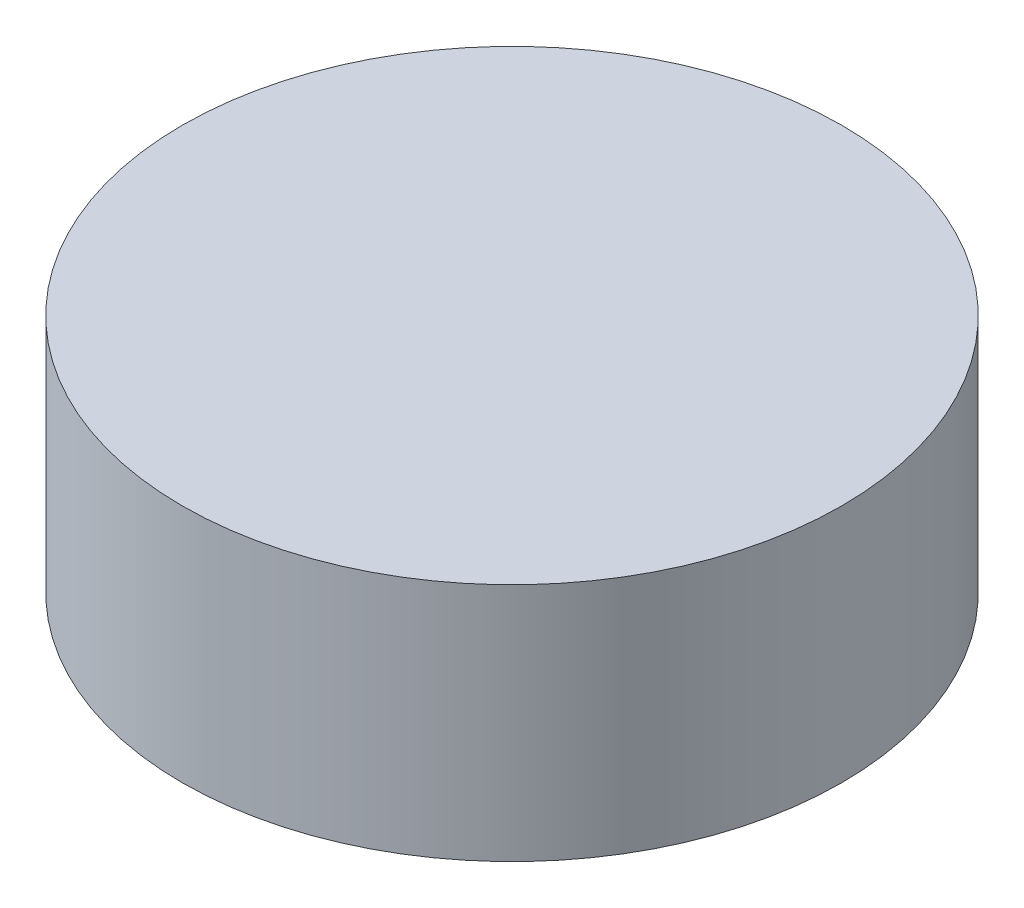
ISO-10303-21;
HEADER;
FILE_DESCRIPTION(('STEP AP214'),'2;1');
FILE_NAME('part.step','',(''),(''),'','','');
FILE_SCHEMA(('AUTOMOTIVE_DESIGN { 1 0 10303 214 1 1 1 1 }'));
ENDSEC;
DATA;
#1=APPLICATION_CONTEXT('core data for automotive mechanical design processes');
#2=APPLICATION_PROTOCOL_DEFINITION('international standard','automotive_design',2000,#1);
#3=PRODUCT_CONTEXT('',#1,'mechanical');
#4=PRODUCT('Part','Part','',(#3));
#5=PRODUCT_RELATED_PRODUCT_CATEGORY('part','',(#4));
#6=PRODUCT_DEFINITION_FORMATION('','',#4);
#7=PRODUCT_DEFINITION_CONTEXT('part definition',#1,'design');
#8=PRODUCT_DEFINITION('design','',#6,#7);
#9=PRODUCT_DEFINITION_SHAPE('','',#8);
#10=(LENGTH_UNIT() NAMED_UNIT(*) SI_UNIT(.MILLI.,.METRE.));
#11=(NAMED_UNIT(*) PLANE_ANGLE_UNIT() SI_UNIT($,.RADIAN.));
#12=(NAMED_UNIT(*) SI_UNIT($,.STERADIAN.) SOLID_ANGLE_UNIT());
#13=UNCERTAINTY_MEASURE_WITH_UNIT(LENGTH_MEASURE(1.E-05),#10,'distance_accuracy_value','');
#14=(GEOMETRIC_REPRESENTATION_CONTEXT(3) GLOBAL_UNCERTAINTY_ASSIGNED_CONTEXT((#13)) GLOBAL_UNIT_ASSIGNED_CONTEXT((#10,
#11,#12)) REPRESENTATION_CONTEXT('',''));
#15=CARTESIAN_POINT('',(0.,0.,0.));
#16=DIRECTION('',(0.,0.,1.));
#17=DIRECTION('',(1.,0.,0.));
#18=AXIS2_PLACEMENT_3D('',#15,#16,#17);
#19=CARTESIAN_POINT('',(0.,0.,0.));
#20=DIRECTION('',(0.,-1.,0.));
#21=DIRECTION('',(0.,0.,-1.));
#22=AXIS2_PLACEMENT_3D('',#19,#20,#21);
#23=CYLINDRICAL_SURFACE('',#22,25.4);
#24=CARTESIAN_POINT('',(0.,-17.78,0.));
#25=DIRECTION('',(0.,-1.,0.));
#26=DIRECTION('',(0.,0.,-1.));
#27=AXIS2_PLACEMENT_3D('',#24,#25,#26);
#28=CIRCLE('',#27,25.4);
#29=CARTESIAN_POINT('',(0.,-17.78,-25.4));
#30=VERTEX_POINT('',#29);
#31=EDGE_CURVE('E10',#30,#30,#28,.T.);
#32=ORIENTED_EDGE('',*,*,#31,.T.);
#33=EDGE_LOOP('',(#32));
#34=FACE_BOUND('',#33,.T.);
#35=CARTESIAN_POINT('',(0.,0.,0.));
#36=DIRECTION('',(0.,-1.,0.));
#37=DIRECTION('',(0.,0.,-1.));
#38=AXIS2_PLACEMENT_3D('',#35,#36,#37);
#39=CIRCLE('',#38,25.4);
#40=CARTESIAN_POINT('',(0.,0.,-25.4));
#41=VERTEX_POINT('',#40);
#42=EDGE_CURVE('E46',#41,#41,#39,.T.);
#43=ORIENTED_EDGE('',*,*,#42,.F.);
#44=EDGE_LOOP('',(#43));
#45=FACE_BOUND('',#44,.T.);
#46=ADVANCED_FACE('F32',(#34,#45),#23,.F.);
#47=CARTESIAN_POINT('',(0.,-17.78,0.));
#48=DIRECTION('',(0.,-1.,0.));
#49=DIRECTION('',(0.,0.,-1.));
#50=AXIS2_PLACEMENT_3D('',#47,#48,#49);
#51=PLANE('',#50);
#52=CARTESIAN_POINT('',(0.,-17.78,0.));
#53=DIRECTION('',(0.,-1.,0.));
#54=DIRECTION('',(0.,0.,-1.));
#55=AXIS2_PLACEMENT_3D('',#52,#53,#54);
#56=CIRCLE('',#55,27.94);
#57=CARTESIAN_POINT('',(0.,-17.78,-27.94));
#58=VERTEX_POINT('',#57);
#59=EDGE_CURVE('E38',#58,#58,#56,.T.);
#60=ORIENTED_EDGE('',*,*,#59,.T.);
#61=EDGE_LOOP('',(#60));
#62=FACE_BOUND('',#61,.T.);
#63=ORIENTED_EDGE('',*,*,#31,.F.);
#64=EDGE_LOOP('',(#63));
#65=FACE_BOUND('',#64,.T.);
#66=ADVANCED_FACE('F55',(#62,#65),#51,.T.);
#67=CARTESIAN_POINT('',(0.,0.,0.));
#68=DIRECTION('',(0.,-1.,0.));
#69=DIRECTION('',(0.,0.,-1.));
#70=AXIS2_PLACEMENT_3D('',#67,#68,#69);
#71=CYLINDRICAL_SURFACE('',#70,27.94);
#72=ORIENTED_EDGE('',*,*,#59,.F.);
#73=EDGE_LOOP('',(#72));
#74=FACE_BOUND('',#73,.T.);
#75=CARTESIAN_POINT('',(0.,2.54,0.));
#76=DIRECTION('',(0.,-1.,0.));
#77=DIRECTION('',(0.,0.,-1.));
#78=AXIS2_PLACEMENT_3D('',#75,#76,#77);
#79=CIRCLE('',#78,27.94);
#80=CARTESIAN_POINT('',(0.,2.54,-27.94));
#81=VERTEX_POINT('',#80);
#82=EDGE_CURVE('E42',#81,#81,#79,.T.);
#83=ORIENTED_EDGE('',*,*,#82,.T.);
#84=EDGE_LOOP('',(#83));
#85=FACE_BOUND('',#84,.T.);
#86=ADVANCED_FACE('F59',(#74,#85),#71,.T.);
#87=CARTESIAN_POINT('',(0.,2.54,0.));
#88=DIRECTION('',(0.,-1.,0.));
#89=DIRECTION('',(0.,0.,-1.));
#90=AXIS2_PLACEMENT_3D('',#87,#88,#89);
#91=PLANE('',#90);
#92=ORIENTED_EDGE('',*,*,#82,.F.);
#93=EDGE_LOOP('',(#92));
#94=FACE_BOUND('',#93,.T.);
#95=ADVANCED_FACE('F63',(#94),#91,.F.);
#96=CARTESIAN_POINT('',(0.,0.,0.));
#97=DIRECTION('',(0.,-1.,0.));
#98=DIRECTION('',(0.,0.,-1.));
#99=AXIS2_PLACEMENT_3D('',#96,#97,#98);
#100=PLANE('',#99);
#101=ORIENTED_EDGE('',*,*,#42,.T.);
#102=EDGE_LOOP('',(#101));
#103=FACE_BOUND('',#102,.T.);
#104=ADVANCED_FACE('F52',(#103),#100,.T.);
#105=CLOSED_SHELL('',(#46,#66,#86,#95,#104));
#106=MANIFOLD_SOLID_BREP('B2',#105);
#107=ADVANCED_BREP_SHAPE_REPRESENTATION('',(#18,#106),#14);
#108=SHAPE_DEFINITION_REPRESENTATION(#9,#107);
ENDSEC;
END-ISO-10303-21;
